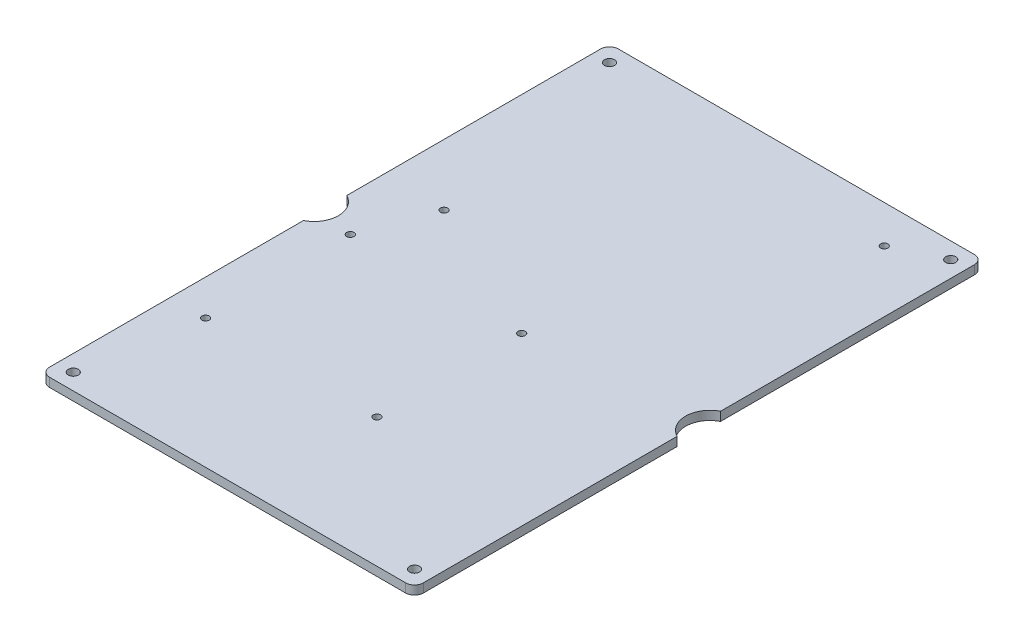
ISO-10303-21;
HEADER;
FILE_DESCRIPTION(('STEP AP214'),'2;1');
FILE_NAME('part.step','',(''),(''),'','','');
FILE_SCHEMA(('AUTOMOTIVE_DESIGN { 1 0 10303 214 1 1 1 1 }'));
ENDSEC;
DATA;
#1=APPLICATION_CONTEXT('core data for automotive mechanical design processes');
#2=APPLICATION_PROTOCOL_DEFINITION('international standard','automotive_design',2000,#1);
#3=PRODUCT_CONTEXT('',#1,'mechanical');
#4=PRODUCT('Part','Part','',(#3));
#5=PRODUCT_RELATED_PRODUCT_CATEGORY('part','',(#4));
#6=PRODUCT_DEFINITION_FORMATION('','',#4);
#7=PRODUCT_DEFINITION_CONTEXT('part definition',#1,'design');
#8=PRODUCT_DEFINITION('design','',#6,#7);
#9=PRODUCT_DEFINITION_SHAPE('','',#8);
#10=(LENGTH_UNIT() NAMED_UNIT(*) SI_UNIT(.MILLI.,.METRE.));
#11=(NAMED_UNIT(*) PLANE_ANGLE_UNIT() SI_UNIT($,.RADIAN.));
#12=(NAMED_UNIT(*) SI_UNIT($,.STERADIAN.) SOLID_ANGLE_UNIT());
#13=UNCERTAINTY_MEASURE_WITH_UNIT(LENGTH_MEASURE(1.E-05),#10,'distance_accuracy_value','');
#14=(GEOMETRIC_REPRESENTATION_CONTEXT(3) GLOBAL_UNCERTAINTY_ASSIGNED_CONTEXT((#13)) GLOBAL_UNIT_ASSIGNED_CONTEXT((#10,
#11,#12)) REPRESENTATION_CONTEXT('',''));
#15=CARTESIAN_POINT('',(0.,0.,0.));
#16=DIRECTION('',(0.,0.,1.));
#17=DIRECTION('',(1.,0.,0.));
#18=AXIS2_PLACEMENT_3D('',#15,#16,#17);
#19=CARTESIAN_POINT('',(-63.2499999999997,3.,96.2500000000004));
#20=DIRECTION('',(1.,0.,0.));
#21=DIRECTION('',(0.,0.,-1.));
#22=AXIS2_PLACEMENT_3D('',#19,#20,#21);
#23=PLANE('',#22);
#24=DIRECTION('',(0.,0.,1.));
#25=VECTOR('',#24,1.);
#26=CARTESIAN_POINT('',(-63.2499999999997,3.,96.2500000000004));
#27=LINE('',#26,#25);
#28=CARTESIAN_POINT('',(-63.2499999999997,3.,-93.2499999999995));
#29=VERTEX_POINT('',#28);
#30=CARTESIAN_POINT('',(-63.2499999999997,3.,-7.34846922834939));
#31=VERTEX_POINT('',#30);
#32=EDGE_CURVE('E125',#29,#31,#27,.T.);
#33=ORIENTED_EDGE('',*,*,#32,.F.);
#34=DIRECTION('',(0.,-1.,0.));
#35=VECTOR('',#34,1.);
#36=CARTESIAN_POINT('',(-63.2499999999997,3.,-93.2499999999995));
#37=LINE('',#36,#35);
#38=CARTESIAN_POINT('',(-63.2499999999997,0.,-93.2499999999995));
#39=VERTEX_POINT('',#38);
#40=EDGE_CURVE('E11',#29,#39,#37,.T.);
#41=ORIENTED_EDGE('',*,*,#40,.T.);
#42=DIRECTION('',(0.,0.,1.));
#43=VECTOR('',#42,1.);
#44=CARTESIAN_POINT('',(-63.2499999999997,0.,96.2500000000004));
#45=LINE('',#44,#43);
#46=CARTESIAN_POINT('',(-63.2499999999997,0.,-7.3484692283494));
#47=VERTEX_POINT('',#46);
#48=EDGE_CURVE('E149',#39,#47,#45,.T.);
#49=ORIENTED_EDGE('',*,*,#48,.T.);
#50=DIRECTION('',(0.,1.,0.));
#51=VECTOR('',#50,1.);
#52=CARTESIAN_POINT('',(-63.2499999999997,-0.00100000000000013,-7.3484692283494));
#53=LINE('',#52,#51);
#54=EDGE_CURVE('E142',#47,#31,#53,.T.);
#55=ORIENTED_EDGE('',*,*,#54,.T.);
#56=EDGE_LOOP('',(#33,#41,#49,#55));
#57=FACE_BOUND('',#56,.T.);
#58=ADVANCED_FACE('F35',(#57),#23,.F.);
#59=CARTESIAN_POINT('',(-63.2499999999997,0.,7.3484692283494));
#60=VERTEX_POINT('',#59);
#61=CARTESIAN_POINT('',(-63.2499999999997,0.,93.2500000000003));
#62=VERTEX_POINT('',#61);
#63=EDGE_CURVE('E179',#60,#62,#45,.T.);
#64=ORIENTED_EDGE('',*,*,#63,.T.);
#65=DIRECTION('',(0.,-1.,0.));
#66=VECTOR('',#65,1.);
#67=CARTESIAN_POINT('',(-63.2499999999997,3.,93.2500000000003));
#68=LINE('',#67,#66);
#69=CARTESIAN_POINT('',(-63.2499999999997,3.,93.2500000000003));
#70=VERTEX_POINT('',#69);
#71=EDGE_CURVE('E196',#62,#70,#68,.F.);
#72=ORIENTED_EDGE('',*,*,#71,.T.);
#73=CARTESIAN_POINT('',(-63.2499999999997,3.,7.3484692283494));
#74=VERTEX_POINT('',#73);
#75=EDGE_CURVE('E137',#74,#70,#27,.T.);
#76=ORIENTED_EDGE('',*,*,#75,.F.);
#77=DIRECTION('',(0.,1.,0.));
#78=VECTOR('',#77,1.);
#79=CARTESIAN_POINT('',(-63.2499999999997,-0.00100000000000013,7.3484692283494));
#80=LINE('',#79,#78);
#81=EDGE_CURVE('E145',#74,#60,#80,.F.);
#82=ORIENTED_EDGE('',*,*,#81,.T.);
#83=EDGE_LOOP('',(#64,#72,#76,#82));
#84=FACE_BOUND('',#83,.T.);
#85=ADVANCED_FACE('F238',(#84),#23,.F.);
#86=CARTESIAN_POINT('',(63.2500000000003,3.,96.2500000000004));
#87=DIRECTION('',(-1.,0.,0.));
#88=DIRECTION('',(0.,0.,1.));
#89=AXIS2_PLACEMENT_3D('',#86,#87,#88);
#90=PLANE('',#89);
#91=DIRECTION('',(0.,0.,-1.));
#92=VECTOR('',#91,1.);
#93=CARTESIAN_POINT('',(63.2500000000003,3.,96.2500000000004));
#94=LINE('',#93,#92);
#95=CARTESIAN_POINT('',(63.2500000000003,3.,93.2500000000004));
#96=VERTEX_POINT('',#95);
#97=CARTESIAN_POINT('',(63.2500000000003,3.,7.3484692283497));
#98=VERTEX_POINT('',#97);
#99=EDGE_CURVE('E167',#96,#98,#94,.T.);
#100=ORIENTED_EDGE('',*,*,#99,.F.);
#101=DIRECTION('',(0.,-1.,0.));
#102=VECTOR('',#101,1.);
#103=CARTESIAN_POINT('',(63.2500000000003,3.,93.2500000000004));
#104=LINE('',#103,#102);
#105=CARTESIAN_POINT('',(63.2500000000003,0.,93.2500000000004));
#106=VERTEX_POINT('',#105);
#107=EDGE_CURVE('E204',#96,#106,#104,.T.);
#108=ORIENTED_EDGE('',*,*,#107,.T.);
#109=DIRECTION('',(0.,0.,-1.));
#110=VECTOR('',#109,1.);
#111=CARTESIAN_POINT('',(63.2500000000003,0.,96.2500000000004));
#112=LINE('',#111,#110);
#113=CARTESIAN_POINT('',(63.2500000000003,0.,7.3484692283497));
#114=VERTEX_POINT('',#113);
#115=EDGE_CURVE('E175',#106,#114,#112,.T.);
#116=ORIENTED_EDGE('',*,*,#115,.T.);
#117=DIRECTION('',(0.,1.,0.));
#118=VECTOR('',#117,1.);
#119=CARTESIAN_POINT('',(63.2500000000003,-0.00100000000000013,7.3484692283497));
#120=LINE('',#119,#118);
#121=EDGE_CURVE('E158',#98,#114,#120,.F.);
#122=ORIENTED_EDGE('',*,*,#121,.F.);
#123=EDGE_LOOP('',(#100,#108,#116,#122));
#124=FACE_BOUND('',#123,.T.);
#125=ADVANCED_FACE('F244',(#124),#90,.F.);
#126=CARTESIAN_POINT('',(63.2500000000003,0.,-7.3484692283497));
#127=VERTEX_POINT('',#126);
#128=CARTESIAN_POINT('',(63.2500000000003,0.,-93.2499999999994));
#129=VERTEX_POINT('',#128);
#130=EDGE_CURVE('E166',#127,#129,#112,.T.);
#131=ORIENTED_EDGE('',*,*,#130,.T.);
#132=DIRECTION('',(0.,-1.,0.));
#133=VECTOR('',#132,1.);
#134=CARTESIAN_POINT('',(63.2500000000003,3.,-93.2499999999994));
#135=LINE('',#134,#133);
#136=CARTESIAN_POINT('',(63.2500000000003,3.,-93.2499999999994));
#137=VERTEX_POINT('',#136);
#138=EDGE_CURVE('E43',#129,#137,#135,.F.);
#139=ORIENTED_EDGE('',*,*,#138,.T.);
#140=CARTESIAN_POINT('',(63.2500000000003,3.,-7.3484692283497));
#141=VERTEX_POINT('',#140);
#142=EDGE_CURVE('E170',#141,#137,#94,.T.);
#143=ORIENTED_EDGE('',*,*,#142,.F.);
#144=DIRECTION('',(0.,1.,0.));
#145=VECTOR('',#144,1.);
#146=CARTESIAN_POINT('',(63.2500000000003,-0.00100000000000013,-7.3484692283497));
#147=LINE('',#146,#145);
#148=EDGE_CURVE('E156',#127,#141,#147,.T.);
#149=ORIENTED_EDGE('',*,*,#148,.F.);
#150=EDGE_LOOP('',(#131,#139,#143,#149));
#151=FACE_BOUND('',#150,.T.);
#152=ADVANCED_FACE('F214',(#151),#90,.F.);
#153=CARTESIAN_POINT('',(63.2500000000003,3.,-96.2499999999994));
#154=DIRECTION('',(0.,0.,1.));
#155=DIRECTION('',(1.,0.,0.));
#156=AXIS2_PLACEMENT_3D('',#153,#154,#155);
#157=PLANE('',#156);
#158=DIRECTION('',(-1.,0.,0.));
#159=VECTOR('',#158,1.);
#160=CARTESIAN_POINT('',(63.2500000000003,3.,-96.2499999999994));
#161=LINE('',#160,#159);
#162=CARTESIAN_POINT('',(60.2500000000003,3.,-96.2499999999994));
#163=VERTEX_POINT('',#162);
#164=CARTESIAN_POINT('',(-60.2499999999997,3.,-96.2499999999995));
#165=VERTEX_POINT('',#164);
#166=EDGE_CURVE('E169',#163,#165,#161,.T.);
#167=ORIENTED_EDGE('',*,*,#166,.F.);
#168=DIRECTION('',(0.,-1.,0.));
#169=VECTOR('',#168,1.);
#170=CARTESIAN_POINT('',(60.2500000000003,3.,-96.2499999999994));
#171=LINE('',#170,#169);
#172=CARTESIAN_POINT('',(60.2500000000003,0.,-96.2499999999994));
#173=VERTEX_POINT('',#172);
#174=EDGE_CURVE('E208',#163,#173,#171,.T.);
#175=ORIENTED_EDGE('',*,*,#174,.T.);
#176=DIRECTION('',(-1.,0.,0.));
#177=VECTOR('',#176,1.);
#178=CARTESIAN_POINT('',(63.2500000000003,0.,-96.2499999999994));
#179=LINE('',#178,#177);
#180=CARTESIAN_POINT('',(-60.2499999999997,0.,-96.2499999999995));
#181=VERTEX_POINT('',#180);
#182=EDGE_CURVE('E177',#173,#181,#179,.T.);
#183=ORIENTED_EDGE('',*,*,#182,.T.);
#184=DIRECTION('',(0.,-1.,0.));
#185=VECTOR('',#184,1.);
#186=CARTESIAN_POINT('',(-60.2499999999997,3.,-96.2499999999995));
#187=LINE('',#186,#185);
#188=EDGE_CURVE('E50',#181,#165,#187,.F.);
#189=ORIENTED_EDGE('',*,*,#188,.T.);
#190=EDGE_LOOP('',(#167,#175,#183,#189));
#191=FACE_BOUND('',#190,.T.);
#192=ADVANCED_FACE('F222',(#191),#157,.F.);
#193=CARTESIAN_POINT('',(63.2500000000003,3.,96.2500000000004));
#194=DIRECTION('',(0.,0.,-1.));
#195=DIRECTION('',(-1.,0.,0.));
#196=AXIS2_PLACEMENT_3D('',#193,#194,#195);
#197=PLANE('',#196);
#198=DIRECTION('',(1.,0.,0.));
#199=VECTOR('',#198,1.);
#200=CARTESIAN_POINT('',(63.2500000000003,3.,96.2500000000004));
#201=LINE('',#200,#199);
#202=CARTESIAN_POINT('',(-60.2499999999997,3.,96.2500000000004));
#203=VERTEX_POINT('',#202);
#204=CARTESIAN_POINT('',(60.2500000000003,3.,96.2500000000004));
#205=VERTEX_POINT('',#204);
#206=EDGE_CURVE('E136',#203,#205,#201,.T.);
#207=ORIENTED_EDGE('',*,*,#206,.F.);
#208=DIRECTION('',(0.,-1.,0.));
#209=VECTOR('',#208,1.);
#210=CARTESIAN_POINT('',(-60.2499999999997,3.,96.2500000000004));
#211=LINE('',#210,#209);
#212=CARTESIAN_POINT('',(-60.2499999999997,0.,96.2500000000004));
#213=VERTEX_POINT('',#212);
#214=EDGE_CURVE('E185',#203,#213,#211,.T.);
#215=ORIENTED_EDGE('',*,*,#214,.T.);
#216=DIRECTION('',(1.,0.,0.));
#217=VECTOR('',#216,1.);
#218=CARTESIAN_POINT('',(63.2500000000003,0.,96.2500000000004));
#219=LINE('',#218,#217);
#220=CARTESIAN_POINT('',(60.2500000000003,0.,96.2500000000004));
#221=VERTEX_POINT('',#220);
#222=EDGE_CURVE('E181',#213,#221,#219,.T.);
#223=ORIENTED_EDGE('',*,*,#222,.T.);
#224=DIRECTION('',(0.,-1.,0.));
#225=VECTOR('',#224,1.);
#226=CARTESIAN_POINT('',(60.2500000000003,3.,96.2500000000004));
#227=LINE('',#226,#225);
#228=EDGE_CURVE('E174',#221,#205,#227,.F.);
#229=ORIENTED_EDGE('',*,*,#228,.T.);
#230=EDGE_LOOP('',(#207,#215,#223,#229));
#231=FACE_BOUND('',#230,.T.);
#232=ADVANCED_FACE('F248',(#231),#197,.F.);
#233=CARTESIAN_POINT('',(0.,3.,0.));
#234=DIRECTION('',(0.,1.,0.));
#235=DIRECTION('',(0.,0.,1.));
#236=AXIS2_PLACEMENT_3D('',#233,#234,#235);
#237=PLANE('',#236);
#238=CARTESIAN_POINT('',(6.7730379891023,3.,52.5000000000022));
#239=DIRECTION('',(0.,-1.,0.));
#240=DIRECTION('',(0.,0.,-1.));
#241=AXIS2_PLACEMENT_3D('',#238,#239,#240);
#242=CIRCLE('',#241,1.23);
#243=CARTESIAN_POINT('',(6.7730379891023,3.,51.2700000000022));
#244=VERTEX_POINT('',#243);
#245=EDGE_CURVE('E335',#244,#244,#242,.T.);
#246=ORIENTED_EDGE('',*,*,#245,.T.);
#247=EDGE_LOOP('',(#246));
#248=FACE_BOUND('',#247,.T.);
#249=CARTESIAN_POINT('',(42.4999988199823,3.,-83.4999996199982));
#250=DIRECTION('',(0.,-1.,0.));
#251=DIRECTION('',(0.,0.,-1.));
#252=AXIS2_PLACEMENT_3D('',#249,#250,#251);
#253=CIRCLE('',#252,1.23);
#254=CARTESIAN_POINT('',(42.4999988199823,3.,-84.7299996199982));
#255=VERTEX_POINT('',#254);
#256=EDGE_CURVE('E345',#255,#255,#253,.T.);
#257=ORIENTED_EDGE('',*,*,#256,.T.);
#258=EDGE_LOOP('',(#257));
#259=FACE_BOUND('',#258,.T.);
#260=CARTESIAN_POINT('',(-42.5000013600172,3.,-19.5000006199976));
#261=DIRECTION('',(0.,-1.,0.));
#262=DIRECTION('',(0.,0.,-1.));
#263=AXIS2_PLACEMENT_3D('',#260,#261,#262);
#264=CIRCLE('',#263,1.23);
#265=CARTESIAN_POINT('',(-42.5000013600172,3.,-20.7300006199976));
#266=VERTEX_POINT('',#265);
#267=EDGE_CURVE('E351',#266,#266,#264,.T.);
#268=ORIENTED_EDGE('',*,*,#267,.T.);
#269=EDGE_LOOP('',(#268));
#270=FACE_BOUND('',#269,.T.);
#271=CARTESIAN_POINT('',(6.7730379891023,3.,3.50000000000234));
#272=DIRECTION('',(0.,-1.,0.));
#273=DIRECTION('',(0.,0.,-1.));
#274=AXIS2_PLACEMENT_3D('',#271,#272,#273);
#275=CIRCLE('',#274,1.23);
#276=CARTESIAN_POINT('',(6.7730379891023,3.,2.27000000000234));
#277=VERTEX_POINT('',#276);
#278=EDGE_CURVE('E357',#277,#277,#275,.T.);
#279=ORIENTED_EDGE('',*,*,#278,.T.);
#280=EDGE_LOOP('',(#279));
#281=FACE_BOUND('',#280,.T.);
#282=CARTESIAN_POINT('',(-51.2269620108977,3.,3.50000000000241));
#283=DIRECTION('',(0.,-1.,0.));
#284=DIRECTION('',(0.,0.,-1.));
#285=AXIS2_PLACEMENT_3D('',#282,#283,#284);
#286=CIRCLE('',#285,1.23);
#287=CARTESIAN_POINT('',(-51.2269620108977,3.,2.27000000000241));
#288=VERTEX_POINT('',#287);
#289=EDGE_CURVE('E363',#288,#288,#286,.T.);
#290=ORIENTED_EDGE('',*,*,#289,.T.);
#291=EDGE_LOOP('',(#290));
#292=FACE_BOUND('',#291,.T.);
#293=CARTESIAN_POINT('',(-51.2269620108976,3.,52.5000000000024));
#294=DIRECTION('',(0.,-1.,0.));
#295=DIRECTION('',(0.,0.,-1.));
#296=AXIS2_PLACEMENT_3D('',#293,#294,#295);
#297=CIRCLE('',#296,1.23);
#298=CARTESIAN_POINT('',(-51.2269620108976,3.,51.2700000000024));
#299=VERTEX_POINT('',#298);
#300=EDGE_CURVE('E369',#299,#299,#297,.T.);
#301=ORIENTED_EDGE('',*,*,#300,.T.);
#302=EDGE_LOOP('',(#301));
#303=FACE_BOUND('',#302,.T.);
#304=CARTESIAN_POINT('',(-57.75,3.,-90.75));
#305=DIRECTION('',(0.,1.,0.));
#306=DIRECTION('',(0.,0.,1.));
#307=AXIS2_PLACEMENT_3D('',#304,#305,#306);
#308=CIRCLE('',#307,1.69999999999999);
#309=CARTESIAN_POINT('',(-57.75,3.,-89.05));
#310=VERTEX_POINT('',#309);
#311=EDGE_CURVE('E372',#310,#310,#308,.T.);
#312=ORIENTED_EDGE('',*,*,#311,.F.);
#313=EDGE_LOOP('',(#312));
#314=FACE_BOUND('',#313,.T.);
#315=CARTESIAN_POINT('',(57.75,3.,90.75));
#316=DIRECTION('',(0.,1.,0.));
#317=DIRECTION('',(0.,0.,1.));
#318=AXIS2_PLACEMENT_3D('',#315,#316,#317);
#319=CIRCLE('',#318,1.69999999999999);
#320=CARTESIAN_POINT('',(57.75,3.,92.45));
#321=VERTEX_POINT('',#320);
#322=EDGE_CURVE('E378',#321,#321,#319,.T.);
#323=ORIENTED_EDGE('',*,*,#322,.F.);
#324=EDGE_LOOP('',(#323));
#325=FACE_BOUND('',#324,.T.);
#326=CARTESIAN_POINT('',(57.75,3.,-90.75));
#327=DIRECTION('',(0.,1.,0.));
#328=DIRECTION('',(0.,0.,1.));
#329=AXIS2_PLACEMENT_3D('',#326,#327,#328);
#330=CIRCLE('',#329,1.69999999999999);
#331=CARTESIAN_POINT('',(57.75,3.,-89.05));
#332=VERTEX_POINT('',#331);
#333=EDGE_CURVE('E384',#332,#332,#330,.T.);
#334=ORIENTED_EDGE('',*,*,#333,.F.);
#335=EDGE_LOOP('',(#334));
#336=FACE_BOUND('',#335,.T.);
#337=CARTESIAN_POINT('',(-57.75,3.,90.75));
#338=DIRECTION('',(0.,1.,0.));
#339=DIRECTION('',(0.,0.,1.));
#340=AXIS2_PLACEMENT_3D('',#337,#338,#339);
#341=CIRCLE('',#340,1.69999999999999);
#342=CARTESIAN_POINT('',(-57.75,3.,92.45));
#343=VERTEX_POINT('',#342);
#344=EDGE_CURVE('E390',#343,#343,#341,.T.);
#345=ORIENTED_EDGE('',*,*,#344,.F.);
#346=EDGE_LOOP('',(#345));
#347=FACE_BOUND('',#346,.T.);
#348=ORIENTED_EDGE('',*,*,#75,.T.);
#349=CARTESIAN_POINT('',(-60.2499999999997,3.,93.2500000000003));
#350=DIRECTION('',(0.,1.,0.));
#351=DIRECTION('',(0.,0.,1.));
#352=AXIS2_PLACEMENT_3D('',#349,#350,#351);
#353=CIRCLE('',#352,3.);
#354=EDGE_CURVE('E202',#70,#203,#353,.T.);
#355=ORIENTED_EDGE('',*,*,#354,.T.);
#356=ORIENTED_EDGE('',*,*,#206,.T.);
#357=CARTESIAN_POINT('',(60.2500000000003,3.,93.2500000000004));
#358=DIRECTION('',(0.,1.,0.));
#359=DIRECTION('',(0.,0.,1.));
#360=AXIS2_PLACEMENT_3D('',#357,#358,#359);
#361=CIRCLE('',#360,3.);
#362=EDGE_CURVE('E200',#205,#96,#361,.T.);
#363=ORIENTED_EDGE('',*,*,#362,.T.);
#364=ORIENTED_EDGE('',*,*,#99,.T.);
#365=CARTESIAN_POINT('',(67.,3.,0.));
#366=DIRECTION('',(0.,1.,0.));
#367=DIRECTION('',(0.,0.,1.));
#368=AXIS2_PLACEMENT_3D('',#365,#366,#367);
#369=CIRCLE('',#368,8.25000000000001);
#370=EDGE_CURVE('E161',#141,#98,#369,.T.);
#371=ORIENTED_EDGE('',*,*,#370,.F.);
#372=ORIENTED_EDGE('',*,*,#142,.T.);
#373=CARTESIAN_POINT('',(60.2500000000003,3.,-93.2499999999994));
#374=DIRECTION('',(0.,1.,0.));
#375=DIRECTION('',(0.,0.,1.));
#376=AXIS2_PLACEMENT_3D('',#373,#374,#375);
#377=CIRCLE('',#376,3.);
#378=EDGE_CURVE('E57',#137,#163,#377,.T.);
#379=ORIENTED_EDGE('',*,*,#378,.T.);
#380=ORIENTED_EDGE('',*,*,#166,.T.);
#381=CARTESIAN_POINT('',(-60.2499999999997,3.,-93.2499999999995));
#382=DIRECTION('',(0.,1.,0.));
#383=DIRECTION('',(0.,0.,1.));
#384=AXIS2_PLACEMENT_3D('',#381,#382,#383);
#385=CIRCLE('',#384,3.);
#386=EDGE_CURVE('E132',#165,#29,#385,.T.);
#387=ORIENTED_EDGE('',*,*,#386,.T.);
#388=ORIENTED_EDGE('',*,*,#32,.T.);
#389=CARTESIAN_POINT('',(-67.,3.,0.));
#390=DIRECTION('',(0.,-1.,0.));
#391=DIRECTION('',(0.,0.,1.));
#392=AXIS2_PLACEMENT_3D('',#389,#390,#391);
#393=CIRCLE('',#392,8.25000000000001);
#394=EDGE_CURVE('E129',#31,#74,#393,.T.);
#395=ORIENTED_EDGE('',*,*,#394,.T.);
#396=EDGE_LOOP('',(#348,#355,#356,#363,#364,#371,#372,#379,#380,#387,#388,#395));
#397=FACE_BOUND('',#396,.T.);
#398=ADVANCED_FACE('F128',(#248,#259,#270,#281,#292,#303,#314,#325,#336,#347,#397),#237,.T.);
#399=CARTESIAN_POINT('',(0.,0.,0.));
#400=DIRECTION('',(0.,1.,0.));
#401=DIRECTION('',(0.,0.,1.));
#402=AXIS2_PLACEMENT_3D('',#399,#400,#401);
#403=PLANE('',#402);
#404=CARTESIAN_POINT('',(6.7730379891023,0.,52.5000000000022));
#405=DIRECTION('',(0.,-1.,0.));
#406=DIRECTION('',(0.,0.,-1.));
#407=AXIS2_PLACEMENT_3D('',#404,#405,#406);
#408=CIRCLE('',#407,1.23);
#409=CARTESIAN_POINT('',(6.7730379891023,0.,51.2700000000022));
#410=VERTEX_POINT('',#409);
#411=EDGE_CURVE('E338',#410,#410,#408,.T.);
#412=ORIENTED_EDGE('',*,*,#411,.F.);
#413=EDGE_LOOP('',(#412));
#414=FACE_BOUND('',#413,.T.);
#415=CARTESIAN_POINT('',(42.4999988199823,0.,-83.4999996199982));
#416=DIRECTION('',(0.,-1.,0.));
#417=DIRECTION('',(0.,0.,-1.));
#418=AXIS2_PLACEMENT_3D('',#415,#416,#417);
#419=CIRCLE('',#418,1.23);
#420=CARTESIAN_POINT('',(42.4999988199823,0.,-84.7299996199982));
#421=VERTEX_POINT('',#420);
#422=EDGE_CURVE('E340',#421,#421,#419,.T.);
#423=ORIENTED_EDGE('',*,*,#422,.F.);
#424=EDGE_LOOP('',(#423));
#425=FACE_BOUND('',#424,.T.);
#426=CARTESIAN_POINT('',(-42.5000013600172,0.,-19.5000006199976));
#427=DIRECTION('',(0.,-1.,0.));
#428=DIRECTION('',(0.,0.,-1.));
#429=AXIS2_PLACEMENT_3D('',#426,#427,#428);
#430=CIRCLE('',#429,1.23);
#431=CARTESIAN_POINT('',(-42.5000013600172,0.,-20.7300006199976));
#432=VERTEX_POINT('',#431);
#433=EDGE_CURVE('E348',#432,#432,#430,.T.);
#434=ORIENTED_EDGE('',*,*,#433,.F.);
#435=EDGE_LOOP('',(#434));
#436=FACE_BOUND('',#435,.T.);
#437=CARTESIAN_POINT('',(6.7730379891023,0.,3.50000000000234));
#438=DIRECTION('',(0.,-1.,0.));
#439=DIRECTION('',(0.,0.,-1.));
#440=AXIS2_PLACEMENT_3D('',#437,#438,#439);
#441=CIRCLE('',#440,1.23);
#442=CARTESIAN_POINT('',(6.7730379891023,0.,2.27000000000234));
#443=VERTEX_POINT('',#442);
#444=EDGE_CURVE('E354',#443,#443,#441,.T.);
#445=ORIENTED_EDGE('',*,*,#444,.F.);
#446=EDGE_LOOP('',(#445));
#447=FACE_BOUND('',#446,.T.);
#448=CARTESIAN_POINT('',(-51.2269620108977,0.,3.50000000000241));
#449=DIRECTION('',(0.,-1.,0.));
#450=DIRECTION('',(0.,0.,-1.));
#451=AXIS2_PLACEMENT_3D('',#448,#449,#450);
#452=CIRCLE('',#451,1.23);
#453=CARTESIAN_POINT('',(-51.2269620108977,0.,2.27000000000241));
#454=VERTEX_POINT('',#453);
#455=EDGE_CURVE('E360',#454,#454,#452,.T.);
#456=ORIENTED_EDGE('',*,*,#455,.F.);
#457=EDGE_LOOP('',(#456));
#458=FACE_BOUND('',#457,.T.);
#459=CARTESIAN_POINT('',(-51.2269620108976,0.,52.5000000000024));
#460=DIRECTION('',(0.,-1.,0.));
#461=DIRECTION('',(0.,0.,-1.));
#462=AXIS2_PLACEMENT_3D('',#459,#460,#461);
#463=CIRCLE('',#462,1.23);
#464=CARTESIAN_POINT('',(-51.2269620108976,0.,51.2700000000024));
#465=VERTEX_POINT('',#464);
#466=EDGE_CURVE('E366',#465,#465,#463,.T.);
#467=ORIENTED_EDGE('',*,*,#466,.F.);
#468=EDGE_LOOP('',(#467));
#469=FACE_BOUND('',#468,.T.);
#470=CARTESIAN_POINT('',(-57.75,0.,-90.75));
#471=DIRECTION('',(0.,1.,0.));
#472=DIRECTION('',(0.,0.,1.));
#473=AXIS2_PLACEMENT_3D('',#470,#471,#472);
#474=CIRCLE('',#473,1.7);
#475=CARTESIAN_POINT('',(-57.75,0.,-89.05));
#476=VERTEX_POINT('',#475);
#477=EDGE_CURVE('E375',#476,#476,#474,.T.);
#478=ORIENTED_EDGE('',*,*,#477,.T.);
#479=EDGE_LOOP('',(#478));
#480=FACE_BOUND('',#479,.T.);
#481=CARTESIAN_POINT('',(57.75,0.,90.75));
#482=DIRECTION('',(0.,1.,0.));
#483=DIRECTION('',(0.,0.,1.));
#484=AXIS2_PLACEMENT_3D('',#481,#482,#483);
#485=CIRCLE('',#484,1.7);
#486=CARTESIAN_POINT('',(57.75,0.,92.45));
#487=VERTEX_POINT('',#486);
#488=EDGE_CURVE('E381',#487,#487,#485,.T.);
#489=ORIENTED_EDGE('',*,*,#488,.T.);
#490=EDGE_LOOP('',(#489));
#491=FACE_BOUND('',#490,.T.);
#492=CARTESIAN_POINT('',(57.75,0.,-90.75));
#493=DIRECTION('',(0.,1.,0.));
#494=DIRECTION('',(0.,0.,1.));
#495=AXIS2_PLACEMENT_3D('',#492,#493,#494);
#496=CIRCLE('',#495,1.7);
#497=CARTESIAN_POINT('',(57.75,0.,-89.05));
#498=VERTEX_POINT('',#497);
#499=EDGE_CURVE('E387',#498,#498,#496,.T.);
#500=ORIENTED_EDGE('',*,*,#499,.T.);
#501=EDGE_LOOP('',(#500));
#502=FACE_BOUND('',#501,.T.);
#503=CARTESIAN_POINT('',(-57.75,0.,90.75));
#504=DIRECTION('',(0.,1.,0.));
#505=DIRECTION('',(0.,0.,1.));
#506=AXIS2_PLACEMENT_3D('',#503,#504,#505);
#507=CIRCLE('',#506,1.7);
#508=CARTESIAN_POINT('',(-57.75,0.,92.45));
#509=VERTEX_POINT('',#508);
#510=EDGE_CURVE('E151',#509,#509,#507,.T.);
#511=ORIENTED_EDGE('',*,*,#510,.T.);
#512=EDGE_LOOP('',(#511));
#513=FACE_BOUND('',#512,.T.);
#514=ORIENTED_EDGE('',*,*,#222,.F.);
#515=CARTESIAN_POINT('',(-60.2499999999997,0.,93.2500000000003));
#516=DIRECTION('',(0.,1.,0.));
#517=DIRECTION('',(0.,0.,1.));
#518=AXIS2_PLACEMENT_3D('',#515,#516,#517);
#519=CIRCLE('',#518,3.);
#520=EDGE_CURVE('E194',#213,#62,#519,.F.);
#521=ORIENTED_EDGE('',*,*,#520,.T.);
#522=ORIENTED_EDGE('',*,*,#63,.F.);
#523=CARTESIAN_POINT('',(-67.,0.,0.));
#524=DIRECTION('',(0.,1.,0.));
#525=DIRECTION('',(0.,0.,1.));
#526=AXIS2_PLACEMENT_3D('',#523,#524,#525);
#527=CIRCLE('',#526,8.25000000000001);
#528=EDGE_CURVE('E146',#60,#47,#527,.T.);
#529=ORIENTED_EDGE('',*,*,#528,.T.);
#530=ORIENTED_EDGE('',*,*,#48,.F.);
#531=CARTESIAN_POINT('',(-60.2499999999997,0.,-93.2499999999995));
#532=DIRECTION('',(0.,1.,0.));
#533=DIRECTION('',(0.,0.,1.));
#534=AXIS2_PLACEMENT_3D('',#531,#532,#533);
#535=CIRCLE('',#534,3.);
#536=EDGE_CURVE('E188',#39,#181,#535,.F.);
#537=ORIENTED_EDGE('',*,*,#536,.T.);
#538=ORIENTED_EDGE('',*,*,#182,.F.);
#539=CARTESIAN_POINT('',(60.2500000000003,0.,-93.2499999999994));
#540=DIRECTION('',(0.,1.,0.));
#541=DIRECTION('',(0.,0.,1.));
#542=AXIS2_PLACEMENT_3D('',#539,#540,#541);
#543=CIRCLE('',#542,3.);
#544=EDGE_CURVE('E190',#173,#129,#543,.F.);
#545=ORIENTED_EDGE('',*,*,#544,.T.);
#546=ORIENTED_EDGE('',*,*,#130,.F.);
#547=CARTESIAN_POINT('',(67.,0.,0.));
#548=DIRECTION('',(0.,1.,0.));
#549=DIRECTION('',(0.,0.,1.));
#550=AXIS2_PLACEMENT_3D('',#547,#548,#549);
#551=CIRCLE('',#550,8.25000000000001);
#552=EDGE_CURVE('E164',#114,#127,#551,.F.);
#553=ORIENTED_EDGE('',*,*,#552,.F.);
#554=ORIENTED_EDGE('',*,*,#115,.F.);
#555=CARTESIAN_POINT('',(60.2500000000003,0.,93.2500000000004));
#556=DIRECTION('',(0.,1.,0.));
#557=DIRECTION('',(0.,0.,1.));
#558=AXIS2_PLACEMENT_3D('',#555,#556,#557);
#559=CIRCLE('',#558,3.);
#560=EDGE_CURVE('E192',#106,#221,#559,.F.);
#561=ORIENTED_EDGE('',*,*,#560,.T.);
#562=EDGE_LOOP('',(#514,#521,#522,#529,#530,#537,#538,#545,#546,#553,#554,#561));
#563=FACE_BOUND('',#562,.T.);
#564=ADVANCED_FACE('F225',(#414,#425,#436,#447,#458,#469,#480,#491,#502,#513,#563),#403,.F.);
#565=CARTESIAN_POINT('',(67.,-0.00100000000000013,0.));
#566=DIRECTION('',(0.,1.,0.));
#567=DIRECTION('',(0.,0.,1.));
#568=AXIS2_PLACEMENT_3D('',#565,#566,#567);
#569=CYLINDRICAL_SURFACE('',#568,8.25000000000001);
#570=ORIENTED_EDGE('',*,*,#121,.T.);
#571=ORIENTED_EDGE('',*,*,#552,.T.);
#572=ORIENTED_EDGE('',*,*,#148,.T.);
#573=ORIENTED_EDGE('',*,*,#370,.T.);
#574=EDGE_LOOP('',(#570,#571,#572,#573));
#575=FACE_BOUND('',#574,.T.);
#576=ADVANCED_FACE('F273',(#575),#569,.F.);
#577=CARTESIAN_POINT('',(-67.,-0.00100000000000013,0.));
#578=DIRECTION('',(0.,1.,0.));
#579=DIRECTION('',(0.,0.,1.));
#580=AXIS2_PLACEMENT_3D('',#577,#578,#579);
#581=CYLINDRICAL_SURFACE('',#580,8.25000000000001);
#582=ORIENTED_EDGE('',*,*,#528,.F.);
#583=ORIENTED_EDGE('',*,*,#81,.F.);
#584=ORIENTED_EDGE('',*,*,#394,.F.);
#585=ORIENTED_EDGE('',*,*,#54,.F.);
#586=EDGE_LOOP('',(#582,#583,#584,#585));
#587=FACE_BOUND('',#586,.T.);
#588=ADVANCED_FACE('F141',(#587),#581,.F.);
#589=CARTESIAN_POINT('',(-57.75,3.,90.75));
#590=DIRECTION('',(0.,1.,0.));
#591=DIRECTION('',(0.,0.,1.));
#592=AXIS2_PLACEMENT_3D('',#589,#590,#591);
#593=CYLINDRICAL_SURFACE('',#592,1.69999999999999);
#594=ORIENTED_EDGE('',*,*,#510,.F.);
#595=EDGE_LOOP('',(#594));
#596=FACE_BOUND('',#595,.T.);
#597=ORIENTED_EDGE('',*,*,#344,.T.);
#598=EDGE_LOOP('',(#597));
#599=FACE_BOUND('',#598,.T.);
#600=ADVANCED_FACE('F298',(#596,#599),#593,.F.);
#601=CARTESIAN_POINT('',(57.75,3.,-90.75));
#602=DIRECTION('',(0.,1.,0.));
#603=DIRECTION('',(0.,0.,1.));
#604=AXIS2_PLACEMENT_3D('',#601,#602,#603);
#605=CYLINDRICAL_SURFACE('',#604,1.69999999999999);
#606=ORIENTED_EDGE('',*,*,#499,.F.);
#607=EDGE_LOOP('',(#606));
#608=FACE_BOUND('',#607,.T.);
#609=ORIENTED_EDGE('',*,*,#333,.T.);
#610=EDGE_LOOP('',(#609));
#611=FACE_BOUND('',#610,.T.);
#612=ADVANCED_FACE('F301',(#608,#611),#605,.F.);
#613=CARTESIAN_POINT('',(57.75,3.,90.75));
#614=DIRECTION('',(0.,1.,0.));
#615=DIRECTION('',(0.,0.,1.));
#616=AXIS2_PLACEMENT_3D('',#613,#614,#615);
#617=CYLINDRICAL_SURFACE('',#616,1.69999999999999);
#618=ORIENTED_EDGE('',*,*,#488,.F.);
#619=EDGE_LOOP('',(#618));
#620=FACE_BOUND('',#619,.T.);
#621=ORIENTED_EDGE('',*,*,#322,.T.);
#622=EDGE_LOOP('',(#621));
#623=FACE_BOUND('',#622,.T.);
#624=ADVANCED_FACE('F305',(#620,#623),#617,.F.);
#625=CARTESIAN_POINT('',(-57.75,3.,-90.75));
#626=DIRECTION('',(0.,1.,0.));
#627=DIRECTION('',(0.,0.,1.));
#628=AXIS2_PLACEMENT_3D('',#625,#626,#627);
#629=CYLINDRICAL_SURFACE('',#628,1.69999999999999);
#630=ORIENTED_EDGE('',*,*,#477,.F.);
#631=EDGE_LOOP('',(#630));
#632=FACE_BOUND('',#631,.T.);
#633=ORIENTED_EDGE('',*,*,#311,.T.);
#634=EDGE_LOOP('',(#633));
#635=FACE_BOUND('',#634,.T.);
#636=ADVANCED_FACE('F257',(#632,#635),#629,.F.);
#637=CARTESIAN_POINT('',(-60.2499999999997,3.,93.2500000000003));
#638=DIRECTION('',(0.,-1.,0.));
#639=DIRECTION('',(0.,0.,-1.));
#640=AXIS2_PLACEMENT_3D('',#637,#638,#639);
#641=CYLINDRICAL_SURFACE('',#640,3.);
#642=ORIENTED_EDGE('',*,*,#354,.F.);
#643=ORIENTED_EDGE('',*,*,#71,.F.);
#644=ORIENTED_EDGE('',*,*,#520,.F.);
#645=ORIENTED_EDGE('',*,*,#214,.F.);
#646=EDGE_LOOP('',(#642,#643,#644,#645));
#647=FACE_BOUND('',#646,.T.);
#648=ADVANCED_FACE('F254',(#647),#641,.T.);
#649=CARTESIAN_POINT('',(60.2500000000003,3.,93.2500000000004));
#650=DIRECTION('',(0.,-1.,0.));
#651=DIRECTION('',(0.,0.,-1.));
#652=AXIS2_PLACEMENT_3D('',#649,#650,#651);
#653=CYLINDRICAL_SURFACE('',#652,3.);
#654=ORIENTED_EDGE('',*,*,#362,.F.);
#655=ORIENTED_EDGE('',*,*,#228,.F.);
#656=ORIENTED_EDGE('',*,*,#560,.F.);
#657=ORIENTED_EDGE('',*,*,#107,.F.);
#658=EDGE_LOOP('',(#654,#655,#656,#657));
#659=FACE_BOUND('',#658,.T.);
#660=ADVANCED_FACE('F236',(#659),#653,.T.);
#661=CARTESIAN_POINT('',(60.2500000000003,3.,-93.2499999999994));
#662=DIRECTION('',(0.,-1.,0.));
#663=DIRECTION('',(0.,0.,-1.));
#664=AXIS2_PLACEMENT_3D('',#661,#662,#663);
#665=CYLINDRICAL_SURFACE('',#664,3.);
#666=ORIENTED_EDGE('',*,*,#378,.F.);
#667=ORIENTED_EDGE('',*,*,#138,.F.);
#668=ORIENTED_EDGE('',*,*,#544,.F.);
#669=ORIENTED_EDGE('',*,*,#174,.F.);
#670=EDGE_LOOP('',(#666,#667,#668,#669));
#671=FACE_BOUND('',#670,.T.);
#672=ADVANCED_FACE('F220',(#671),#665,.T.);
#673=CARTESIAN_POINT('',(-60.2499999999997,3.,-93.2499999999995));
#674=DIRECTION('',(0.,-1.,0.));
#675=DIRECTION('',(0.,0.,-1.));
#676=AXIS2_PLACEMENT_3D('',#673,#674,#675);
#677=CYLINDRICAL_SURFACE('',#676,3.);
#678=ORIENTED_EDGE('',*,*,#386,.F.);
#679=ORIENTED_EDGE('',*,*,#188,.F.);
#680=ORIENTED_EDGE('',*,*,#536,.F.);
#681=ORIENTED_EDGE('',*,*,#40,.F.);
#682=EDGE_LOOP('',(#678,#679,#680,#681));
#683=FACE_BOUND('',#682,.T.);
#684=ADVANCED_FACE('F37',(#683),#677,.T.);
#685=CARTESIAN_POINT('',(-51.2269620108976,0.,52.5000000000024));
#686=DIRECTION('',(0.,-1.,0.));
#687=DIRECTION('',(0.,0.,-1.));
#688=AXIS2_PLACEMENT_3D('',#685,#686,#687);
#689=CYLINDRICAL_SURFACE('',#688,1.23);
#690=ORIENTED_EDGE('',*,*,#300,.F.);
#691=EDGE_LOOP('',(#690));
#692=FACE_BOUND('',#691,.T.);
#693=ORIENTED_EDGE('',*,*,#466,.T.);
#694=EDGE_LOOP('',(#693));
#695=FACE_BOUND('',#694,.T.);
#696=ADVANCED_FACE('F228',(#692,#695),#689,.F.);
#697=CARTESIAN_POINT('',(-51.2269620108977,0.,3.50000000000241));
#698=DIRECTION('',(0.,-1.,0.));
#699=DIRECTION('',(0.,0.,-1.));
#700=AXIS2_PLACEMENT_3D('',#697,#698,#699);
#701=CYLINDRICAL_SURFACE('',#700,1.23);
#702=ORIENTED_EDGE('',*,*,#289,.F.);
#703=EDGE_LOOP('',(#702));
#704=FACE_BOUND('',#703,.T.);
#705=ORIENTED_EDGE('',*,*,#455,.T.);
#706=EDGE_LOOP('',(#705));
#707=FACE_BOUND('',#706,.T.);
#708=ADVANCED_FACE('F233',(#704,#707),#701,.F.);
#709=CARTESIAN_POINT('',(6.7730379891023,0.,3.50000000000234));
#710=DIRECTION('',(0.,-1.,0.));
#711=DIRECTION('',(0.,0.,-1.));
#712=AXIS2_PLACEMENT_3D('',#709,#710,#711);
#713=CYLINDRICAL_SURFACE('',#712,1.23);
#714=ORIENTED_EDGE('',*,*,#278,.F.);
#715=EDGE_LOOP('',(#714));
#716=FACE_BOUND('',#715,.T.);
#717=ORIENTED_EDGE('',*,*,#444,.T.);
#718=EDGE_LOOP('',(#717));
#719=FACE_BOUND('',#718,.T.);
#720=ADVANCED_FACE('F315',(#716,#719),#713,.F.);
#721=CARTESIAN_POINT('',(-42.5000013600172,0.,-19.5000006199976));
#722=DIRECTION('',(0.,-1.,0.));
#723=DIRECTION('',(0.,0.,-1.));
#724=AXIS2_PLACEMENT_3D('',#721,#722,#723);
#725=CYLINDRICAL_SURFACE('',#724,1.23);
#726=ORIENTED_EDGE('',*,*,#267,.F.);
#727=EDGE_LOOP('',(#726));
#728=FACE_BOUND('',#727,.T.);
#729=ORIENTED_EDGE('',*,*,#433,.T.);
#730=EDGE_LOOP('',(#729));
#731=FACE_BOUND('',#730,.T.);
#732=ADVANCED_FACE('F319',(#728,#731),#725,.F.);
#733=CARTESIAN_POINT('',(42.4999988199823,0.,-83.4999996199982));
#734=DIRECTION('',(0.,-1.,0.));
#735=DIRECTION('',(0.,0.,-1.));
#736=AXIS2_PLACEMENT_3D('',#733,#734,#735);
#737=CYLINDRICAL_SURFACE('',#736,1.23);
#738=ORIENTED_EDGE('',*,*,#256,.F.);
#739=EDGE_LOOP('',(#738));
#740=FACE_BOUND('',#739,.T.);
#741=ORIENTED_EDGE('',*,*,#422,.T.);
#742=EDGE_LOOP('',(#741));
#743=FACE_BOUND('',#742,.T.);
#744=ADVANCED_FACE('F323',(#740,#743),#737,.F.);
#745=CARTESIAN_POINT('',(6.7730379891023,0.,52.5000000000022));
#746=DIRECTION('',(0.,-1.,0.));
#747=DIRECTION('',(0.,0.,-1.));
#748=AXIS2_PLACEMENT_3D('',#745,#746,#747);
#749=CYLINDRICAL_SURFACE('',#748,1.23);
#750=ORIENTED_EDGE('',*,*,#245,.F.);
#751=EDGE_LOOP('',(#750));
#752=FACE_BOUND('',#751,.T.);
#753=ORIENTED_EDGE('',*,*,#411,.T.);
#754=EDGE_LOOP('',(#753));
#755=FACE_BOUND('',#754,.T.);
#756=ADVANCED_FACE('F327',(#752,#755),#749,.F.);
#757=CLOSED_SHELL('',(#58,#85,#125,#152,#192,#232,#398,#564,#576,#588,#600,#612,#624,#636,#648,
#660,#672,#684,#696,#708,#720,#732,#744,#756));
#758=MANIFOLD_SOLID_BREP('B2',#757);
#759=ADVANCED_BREP_SHAPE_REPRESENTATION('',(#18,#758),#14);
#760=SHAPE_DEFINITION_REPRESENTATION(#9,#759);
ENDSEC;
END-ISO-10303-21;
